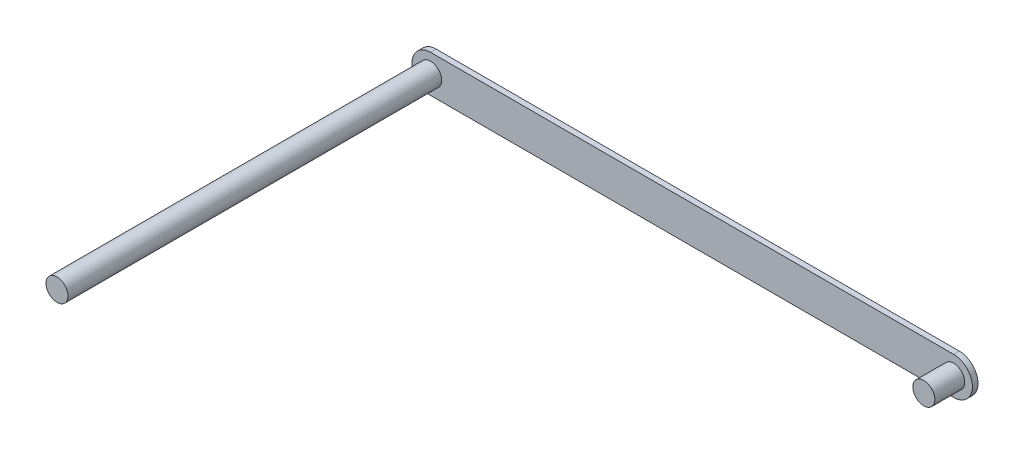
ISO-10303-21;
HEADER;
FILE_DESCRIPTION(('STEP AP214'),'2;1');
FILE_NAME('part.step','',(''),(''),'','','');
FILE_SCHEMA(('AUTOMOTIVE_DESIGN { 1 0 10303 214 1 1 1 1 }'));
ENDSEC;
DATA;
#1=APPLICATION_CONTEXT('core data for automotive mechanical design processes');
#2=APPLICATION_PROTOCOL_DEFINITION('international standard','automotive_design',2000,#1);
#3=PRODUCT_CONTEXT('',#1,'mechanical');
#4=PRODUCT('Part','Part','',(#3));
#5=PRODUCT_RELATED_PRODUCT_CATEGORY('part','',(#4));
#6=PRODUCT_DEFINITION_FORMATION('','',#4);
#7=PRODUCT_DEFINITION_CONTEXT('part definition',#1,'design');
#8=PRODUCT_DEFINITION('design','',#6,#7);
#9=PRODUCT_DEFINITION_SHAPE('','',#8);
#10=(LENGTH_UNIT() NAMED_UNIT(*) SI_UNIT(.MILLI.,.METRE.));
#11=(NAMED_UNIT(*) PLANE_ANGLE_UNIT() SI_UNIT($,.RADIAN.));
#12=(NAMED_UNIT(*) SI_UNIT($,.STERADIAN.) SOLID_ANGLE_UNIT());
#13=UNCERTAINTY_MEASURE_WITH_UNIT(LENGTH_MEASURE(1.E-05),#10,'distance_accuracy_value','');
#14=(GEOMETRIC_REPRESENTATION_CONTEXT(3) GLOBAL_UNCERTAINTY_ASSIGNED_CONTEXT((#13)) GLOBAL_UNIT_ASSIGNED_CONTEXT((#10,
#11,#12)) REPRESENTATION_CONTEXT('',''));
#15=CARTESIAN_POINT('',(0.,0.,0.));
#16=DIRECTION('',(0.,0.,1.));
#17=DIRECTION('',(1.,0.,0.));
#18=AXIS2_PLACEMENT_3D('',#15,#16,#17);
#19=CARTESIAN_POINT('',(0.,0.,1.5));
#20=DIRECTION('',(0.,0.,-1.));
#21=DIRECTION('',(-1.,0.,0.));
#22=AXIS2_PLACEMENT_3D('',#19,#20,#21);
#23=CYLINDRICAL_SURFACE('',#22,5.);
#24=CARTESIAN_POINT('',(0.,0.,0.));
#25=DIRECTION('',(0.,0.,1.));
#26=DIRECTION('',(1.,0.,0.));
#27=AXIS2_PLACEMENT_3D('',#24,#25,#26);
#28=CIRCLE('',#27,5.);
#29=CARTESIAN_POINT('',(0.,5.,0.));
#30=VERTEX_POINT('',#29);
#31=CARTESIAN_POINT('',(0.,-5.00000000000017,0.));
#32=VERTEX_POINT('',#31);
#33=EDGE_CURVE('E101',#30,#32,#28,.T.);
#34=ORIENTED_EDGE('',*,*,#33,.T.);
#35=DIRECTION('',(0.,0.,-1.));
#36=VECTOR('',#35,1.);
#37=CARTESIAN_POINT('',(0.,-5.00000000000017,1.5));
#38=LINE('',#37,#36);
#39=CARTESIAN_POINT('',(0.,-5.00000000000017,1.5));
#40=VERTEX_POINT('',#39);
#41=EDGE_CURVE('E11',#40,#32,#38,.T.);
#42=ORIENTED_EDGE('',*,*,#41,.F.);
#43=CARTESIAN_POINT('',(0.,0.,1.5));
#44=DIRECTION('',(0.,0.,1.));
#45=DIRECTION('',(1.,0.,0.));
#46=AXIS2_PLACEMENT_3D('',#43,#44,#45);
#47=CIRCLE('',#46,5.);
#48=CARTESIAN_POINT('',(0.,5.,1.5));
#49=VERTEX_POINT('',#48);
#50=EDGE_CURVE('E89',#49,#40,#47,.T.);
#51=ORIENTED_EDGE('',*,*,#50,.F.);
#52=DIRECTION('',(0.,0.,-1.));
#53=VECTOR('',#52,1.);
#54=CARTESIAN_POINT('',(0.,5.,1.5));
#55=LINE('',#54,#53);
#56=EDGE_CURVE('E97',#49,#30,#55,.T.);
#57=ORIENTED_EDGE('',*,*,#56,.T.);
#58=EDGE_LOOP('',(#34,#42,#51,#57));
#59=FACE_BOUND('',#58,.T.);
#60=ADVANCED_FACE('F38',(#59),#23,.T.);
#61=CARTESIAN_POINT('',(0.,-5.00000000000017,1.5));
#62=DIRECTION('',(0.,1.,0.));
#63=DIRECTION('',(-1.,0.,0.));
#64=AXIS2_PLACEMENT_3D('',#61,#62,#63);
#65=PLANE('',#64);
#66=DIRECTION('',(1.,0.,0.));
#67=VECTOR('',#66,1.);
#68=CARTESIAN_POINT('',(0.,-5.00000000000017,0.));
#69=LINE('',#68,#67);
#70=CARTESIAN_POINT('',(140.,-5.00000000000003,0.));
#71=VERTEX_POINT('',#70);
#72=EDGE_CURVE('E93',#32,#71,#69,.T.);
#73=ORIENTED_EDGE('',*,*,#72,.T.);
#74=DIRECTION('',(0.,0.,-1.));
#75=VECTOR('',#74,1.);
#76=CARTESIAN_POINT('',(140.,-5.00000000000003,1.5));
#77=LINE('',#76,#75);
#78=CARTESIAN_POINT('',(140.,-5.00000000000003,1.5));
#79=VERTEX_POINT('',#78);
#80=EDGE_CURVE('E46',#79,#71,#77,.T.);
#81=ORIENTED_EDGE('',*,*,#80,.F.);
#82=DIRECTION('',(1.,0.,0.));
#83=VECTOR('',#82,1.);
#84=CARTESIAN_POINT('',(0.,-5.00000000000017,1.5));
#85=LINE('',#84,#83);
#86=EDGE_CURVE('E84',#40,#79,#85,.T.);
#87=ORIENTED_EDGE('',*,*,#86,.F.);
#88=ORIENTED_EDGE('',*,*,#41,.T.);
#89=EDGE_LOOP('',(#73,#81,#87,#88));
#90=FACE_BOUND('',#89,.T.);
#91=ADVANCED_FACE('F92',(#90),#65,.F.);
#92=CARTESIAN_POINT('',(140.,0.,1.5));
#93=DIRECTION('',(0.,0.,-1.));
#94=DIRECTION('',(-1.,0.,0.));
#95=AXIS2_PLACEMENT_3D('',#92,#93,#94);
#96=CYLINDRICAL_SURFACE('',#95,4.99999999999999);
#97=CARTESIAN_POINT('',(140.,0.,0.));
#98=DIRECTION('',(0.,0.,1.));
#99=DIRECTION('',(1.,0.,0.));
#100=AXIS2_PLACEMENT_3D('',#97,#98,#99);
#101=CIRCLE('',#100,4.99999999999999);
#102=CARTESIAN_POINT('',(140.,4.99999999999998,0.));
#103=VERTEX_POINT('',#102);
#104=EDGE_CURVE('E71',#71,#103,#101,.T.);
#105=ORIENTED_EDGE('',*,*,#104,.T.);
#106=DIRECTION('',(0.,0.,-1.));
#107=VECTOR('',#106,1.);
#108=CARTESIAN_POINT('',(140.,4.99999999999998,1.5));
#109=LINE('',#108,#107);
#110=CARTESIAN_POINT('',(140.,4.99999999999998,1.5));
#111=VERTEX_POINT('',#110);
#112=EDGE_CURVE('E94',#111,#103,#109,.T.);
#113=ORIENTED_EDGE('',*,*,#112,.F.);
#114=CARTESIAN_POINT('',(140.,0.,1.5));
#115=DIRECTION('',(0.,0.,1.));
#116=DIRECTION('',(1.,0.,0.));
#117=AXIS2_PLACEMENT_3D('',#114,#115,#116);
#118=CIRCLE('',#117,4.99999999999999);
#119=EDGE_CURVE('E87',#79,#111,#118,.T.);
#120=ORIENTED_EDGE('',*,*,#119,.F.);
#121=ORIENTED_EDGE('',*,*,#80,.T.);
#122=EDGE_LOOP('',(#105,#113,#120,#121));
#123=FACE_BOUND('',#122,.T.);
#124=ADVANCED_FACE('F95',(#123),#96,.T.);
#125=CARTESIAN_POINT('',(0.,5.,1.5));
#126=DIRECTION('',(0.,-1.,0.));
#127=DIRECTION('',(1.,0.,0.));
#128=AXIS2_PLACEMENT_3D('',#125,#126,#127);
#129=PLANE('',#128);
#130=DIRECTION('',(-1.,0.,0.));
#131=VECTOR('',#130,1.);
#132=CARTESIAN_POINT('',(0.,5.,0.));
#133=LINE('',#132,#131);
#134=EDGE_CURVE('E77',#103,#30,#133,.T.);
#135=ORIENTED_EDGE('',*,*,#134,.T.);
#136=ORIENTED_EDGE('',*,*,#56,.F.);
#137=DIRECTION('',(-1.,0.,0.));
#138=VECTOR('',#137,1.);
#139=CARTESIAN_POINT('',(0.,5.,1.5));
#140=LINE('',#139,#138);
#141=EDGE_CURVE('E54',#111,#49,#140,.T.);
#142=ORIENTED_EDGE('',*,*,#141,.F.);
#143=ORIENTED_EDGE('',*,*,#112,.T.);
#144=EDGE_LOOP('',(#135,#136,#142,#143));
#145=FACE_BOUND('',#144,.T.);
#146=ADVANCED_FACE('F109',(#145),#129,.F.);
#147=CARTESIAN_POINT('',(0.,0.,1.5));
#148=DIRECTION('',(0.,0.,1.));
#149=DIRECTION('',(1.,0.,0.));
#150=AXIS2_PLACEMENT_3D('',#147,#148,#149);
#151=PLANE('',#150);
#152=CARTESIAN_POINT('',(140.,0.,1.5));
#153=DIRECTION('',(0.,0.,1.));
#154=DIRECTION('',(1.,0.,0.));
#155=AXIS2_PLACEMENT_3D('',#152,#153,#154);
#156=CIRCLE('',#155,2.95);
#157=CARTESIAN_POINT('',(142.95,0.,1.5));
#158=VERTEX_POINT('',#157);
#159=EDGE_CURVE('E118',#158,#158,#156,.T.);
#160=ORIENTED_EDGE('',*,*,#159,.F.);
#161=EDGE_LOOP('',(#160));
#162=FACE_BOUND('',#161,.T.);
#163=CARTESIAN_POINT('',(0.,0.,1.5));
#164=DIRECTION('',(0.,0.,1.));
#165=DIRECTION('',(1.,0.,0.));
#166=AXIS2_PLACEMENT_3D('',#163,#164,#165);
#167=CIRCLE('',#166,2.95);
#168=CARTESIAN_POINT('',(2.95,0.,1.5));
#169=VERTEX_POINT('',#168);
#170=EDGE_CURVE('E104',#169,#169,#167,.T.);
#171=ORIENTED_EDGE('',*,*,#170,.F.);
#172=EDGE_LOOP('',(#171));
#173=FACE_BOUND('',#172,.T.);
#174=ORIENTED_EDGE('',*,*,#50,.T.);
#175=ORIENTED_EDGE('',*,*,#86,.T.);
#176=ORIENTED_EDGE('',*,*,#119,.T.);
#177=ORIENTED_EDGE('',*,*,#141,.T.);
#178=EDGE_LOOP('',(#174,#175,#176,#177));
#179=FACE_BOUND('',#178,.T.);
#180=ADVANCED_FACE('F85',(#162,#173,#179),#151,.T.);
#181=CARTESIAN_POINT('',(0.,0.,0.));
#182=DIRECTION('',(0.,0.,1.));
#183=DIRECTION('',(1.,0.,0.));
#184=AXIS2_PLACEMENT_3D('',#181,#182,#183);
#185=PLANE('',#184);
#186=ORIENTED_EDGE('',*,*,#33,.F.);
#187=ORIENTED_EDGE('',*,*,#134,.F.);
#188=ORIENTED_EDGE('',*,*,#104,.F.);
#189=ORIENTED_EDGE('',*,*,#72,.F.);
#190=EDGE_LOOP('',(#186,#187,#188,#189));
#191=FACE_BOUND('',#190,.T.);
#192=ADVANCED_FACE('F112',(#191),#185,.F.);
#193=CARTESIAN_POINT('',(0.,0.,9.49999999999999));
#194=DIRECTION('',(0.,0.,-1.));
#195=DIRECTION('',(-1.,0.,0.));
#196=AXIS2_PLACEMENT_3D('',#193,#194,#195);
#197=CYLINDRICAL_SURFACE('',#196,2.95);
#198=ORIENTED_EDGE('',*,*,#170,.T.);
#199=EDGE_LOOP('',(#198));
#200=FACE_BOUND('',#199,.T.);
#201=CARTESIAN_POINT('',(0.,0.,101.5));
#202=DIRECTION('',(0.,0.,1.));
#203=DIRECTION('',(1.,0.,0.));
#204=AXIS2_PLACEMENT_3D('',#201,#202,#203);
#205=CIRCLE('',#204,2.95);
#206=CARTESIAN_POINT('',(2.95,0.,101.5));
#207=VERTEX_POINT('',#206);
#208=EDGE_CURVE('E121',#207,#207,#205,.T.);
#209=ORIENTED_EDGE('',*,*,#208,.F.);
#210=EDGE_LOOP('',(#209));
#211=FACE_BOUND('',#210,.T.);
#212=ADVANCED_FACE('F129',(#200,#211),#197,.T.);
#213=CARTESIAN_POINT('',(140.,0.,9.49999999999999));
#214=DIRECTION('',(0.,0.,-1.));
#215=DIRECTION('',(-1.,0.,0.));
#216=AXIS2_PLACEMENT_3D('',#213,#214,#215);
#217=CYLINDRICAL_SURFACE('',#216,2.95);
#218=CARTESIAN_POINT('',(140.,0.,9.49999999999999));
#219=DIRECTION('',(0.,0.,1.));
#220=DIRECTION('',(1.,0.,0.));
#221=AXIS2_PLACEMENT_3D('',#218,#219,#220);
#222=CIRCLE('',#221,2.95);
#223=CARTESIAN_POINT('',(142.95,0.,9.49999999999999));
#224=VERTEX_POINT('',#223);
#225=EDGE_CURVE('E117',#224,#224,#222,.T.);
#226=ORIENTED_EDGE('',*,*,#225,.F.);
#227=EDGE_LOOP('',(#226));
#228=FACE_BOUND('',#227,.T.);
#229=ORIENTED_EDGE('',*,*,#159,.T.);
#230=EDGE_LOOP('',(#229));
#231=FACE_BOUND('',#230,.T.);
#232=ADVANCED_FACE('F131',(#228,#231),#217,.T.);
#233=CARTESIAN_POINT('',(140.,0.,9.49999999999999));
#234=DIRECTION('',(0.,0.,1.));
#235=DIRECTION('',(1.,0.,0.));
#236=AXIS2_PLACEMENT_3D('',#233,#234,#235);
#237=PLANE('',#236);
#238=ORIENTED_EDGE('',*,*,#225,.T.);
#239=EDGE_LOOP('',(#238));
#240=FACE_BOUND('',#239,.T.);
#241=ADVANCED_FACE('F138',(#240),#237,.T.);
#242=CARTESIAN_POINT('',(0.,0.,101.5));
#243=DIRECTION('',(0.,0.,1.));
#244=DIRECTION('',(1.,0.,0.));
#245=AXIS2_PLACEMENT_3D('',#242,#243,#244);
#246=PLANE('',#245);
#247=ORIENTED_EDGE('',*,*,#208,.T.);
#248=EDGE_LOOP('',(#247));
#249=FACE_BOUND('',#248,.T.);
#250=ADVANCED_FACE('F127',(#249),#246,.T.);
#251=CLOSED_SHELL('',(#60,#91,#124,#146,#180,#192,#212,#232,#241,#250));
#252=MANIFOLD_SOLID_BREP('B2',#251);
#253=ADVANCED_BREP_SHAPE_REPRESENTATION('',(#18,#252),#14);
#254=SHAPE_DEFINITION_REPRESENTATION(#9,#253);
ENDSEC;
END-ISO-10303-21;
